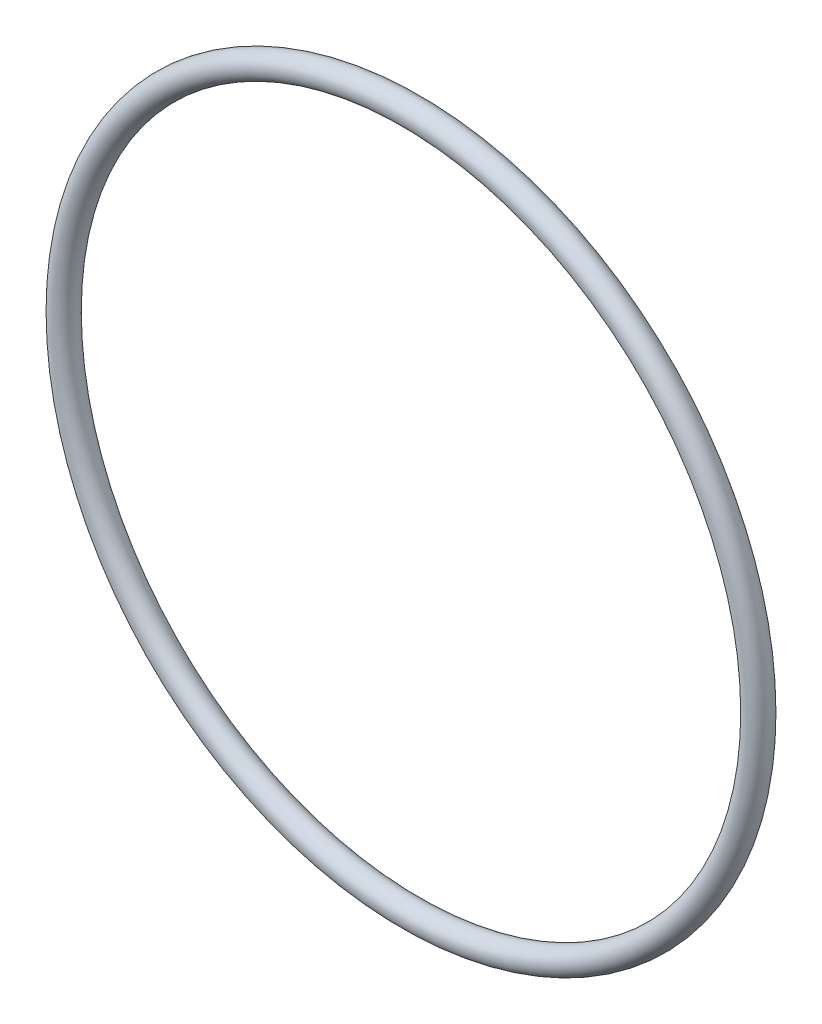
ISO-10303-21;
HEADER;
FILE_DESCRIPTION(('STEP AP214'),'2;1');
FILE_NAME('part.step','',(''),(''),'','','');
FILE_SCHEMA(('AUTOMOTIVE_DESIGN { 1 0 10303 214 1 1 1 1 }'));
ENDSEC;
DATA;
#1=APPLICATION_CONTEXT('core data for automotive mechanical design processes');
#2=APPLICATION_PROTOCOL_DEFINITION('international standard','automotive_design',2000,#1);
#3=PRODUCT_CONTEXT('',#1,'mechanical');
#4=PRODUCT('Part','Part','',(#3));
#5=PRODUCT_RELATED_PRODUCT_CATEGORY('part','',(#4));
#6=PRODUCT_DEFINITION_FORMATION('','',#4);
#7=PRODUCT_DEFINITION_CONTEXT('part definition',#1,'design');
#8=PRODUCT_DEFINITION('design','',#6,#7);
#9=PRODUCT_DEFINITION_SHAPE('','',#8);
#10=(LENGTH_UNIT() NAMED_UNIT(*) SI_UNIT(.MILLI.,.METRE.));
#11=(NAMED_UNIT(*) PLANE_ANGLE_UNIT() SI_UNIT($,.RADIAN.));
#12=(NAMED_UNIT(*) SI_UNIT($,.STERADIAN.) SOLID_ANGLE_UNIT());
#13=UNCERTAINTY_MEASURE_WITH_UNIT(LENGTH_MEASURE(1.E-05),#10,'distance_accuracy_value','');
#14=(GEOMETRIC_REPRESENTATION_CONTEXT(3) GLOBAL_UNCERTAINTY_ASSIGNED_CONTEXT((#13)) GLOBAL_UNIT_ASSIGNED_CONTEXT((#10,
#11,#12)) REPRESENTATION_CONTEXT('',''));
#15=CARTESIAN_POINT('',(0.,0.,0.));
#16=DIRECTION('',(0.,0.,1.));
#17=DIRECTION('',(1.,0.,0.));
#18=AXIS2_PLACEMENT_3D('',#15,#16,#17);
#19=CARTESIAN_POINT('',(0.,0.,0.));
#20=DIRECTION('',(0.,0.,1.));
#21=DIRECTION('',(1.,0.,0.));
#22=AXIS2_PLACEMENT_3D('',#19,#20,#21);
#23=TOROIDAL_SURFACE('',#22,49.1871,1.76530000000001);
#24=CARTESIAN_POINT('',(50.9524,0.,0.));
#25=VERTEX_POINT('',#24);
#26=VERTEX_LOOP('',#25);
#27=FACE_BOUND('',#26,.T.);
#28=ADVANCED_FACE('F35',(#27),#23,.T.);
#29=CLOSED_SHELL('',(#28));
#30=MANIFOLD_SOLID_BREP('B2',#29);
#31=ADVANCED_BREP_SHAPE_REPRESENTATION('',(#18,#30),#14);
#32=SHAPE_DEFINITION_REPRESENTATION(#9,#31);
ENDSEC;
END-ISO-10303-21;
